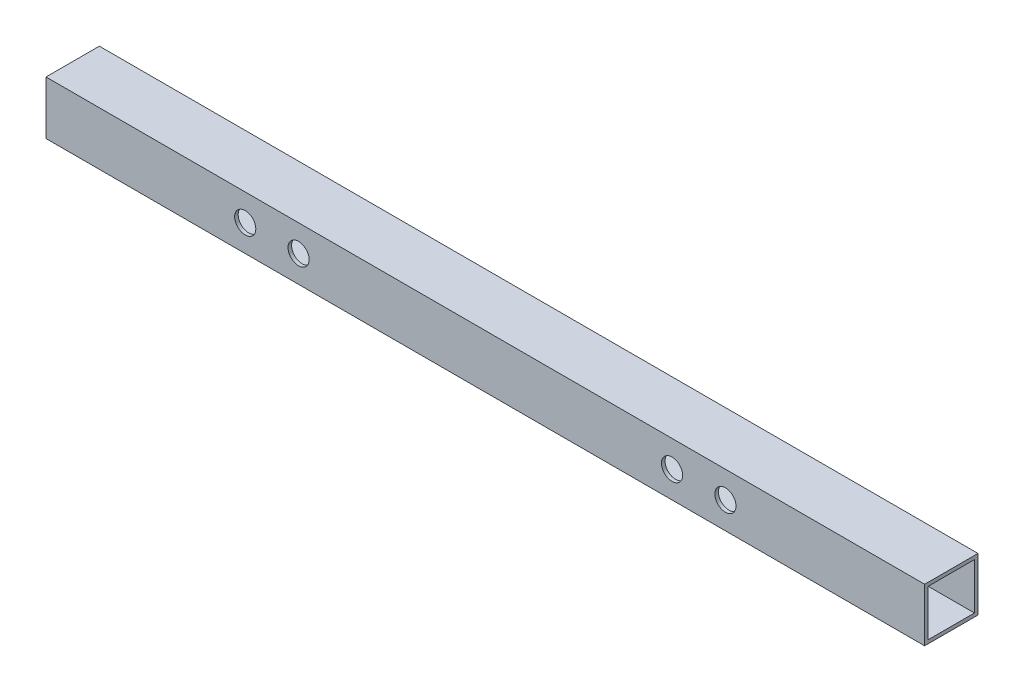
ISO-10303-21;
HEADER;
FILE_DESCRIPTION(('STEP AP214'),'2;1');
FILE_NAME('part.step','',(''),(''),'','','');
FILE_SCHEMA(('AUTOMOTIVE_DESIGN { 1 0 10303 214 1 1 1 1 }'));
ENDSEC;
DATA;
#1=APPLICATION_CONTEXT('core data for automotive mechanical design processes');
#2=APPLICATION_PROTOCOL_DEFINITION('international standard','automotive_design',2000,#1);
#3=PRODUCT_CONTEXT('',#1,'mechanical');
#4=PRODUCT('Part','Part','',(#3));
#5=PRODUCT_RELATED_PRODUCT_CATEGORY('part','',(#4));
#6=PRODUCT_DEFINITION_FORMATION('','',#4);
#7=PRODUCT_DEFINITION_CONTEXT('part definition',#1,'design');
#8=PRODUCT_DEFINITION('design','',#6,#7);
#9=PRODUCT_DEFINITION_SHAPE('','',#8);
#10=(LENGTH_UNIT() NAMED_UNIT(*) SI_UNIT(.MILLI.,.METRE.));
#11=(NAMED_UNIT(*) PLANE_ANGLE_UNIT() SI_UNIT($,.RADIAN.));
#12=(NAMED_UNIT(*) SI_UNIT($,.STERADIAN.) SOLID_ANGLE_UNIT());
#13=UNCERTAINTY_MEASURE_WITH_UNIT(LENGTH_MEASURE(1.E-05),#10,'distance_accuracy_value','');
#14=(GEOMETRIC_REPRESENTATION_CONTEXT(3) GLOBAL_UNCERTAINTY_ASSIGNED_CONTEXT((#13)) GLOBAL_UNIT_ASSIGNED_CONTEXT((#10,
#11,#12)) REPRESENTATION_CONTEXT('',''));
#15=CARTESIAN_POINT('',(0.,0.,0.));
#16=DIRECTION('',(0.,0.,1.));
#17=DIRECTION('',(1.,0.,0.));
#18=AXIS2_PLACEMENT_3D('',#15,#16,#17);
#19=CARTESIAN_POINT('',(422.2747248,-12.7,25.4));
#20=DIRECTION('',(0.,0.,-1.));
#21=DIRECTION('',(-1.,0.,0.));
#22=AXIS2_PLACEMENT_3D('',#19,#20,#21);
#23=PLANE('',#22);
#24=CARTESIAN_POINT('',(120.2373624,0.,25.4));
#25=DIRECTION('',(0.,0.,-1.));
#26=DIRECTION('',(1.,0.,0.));
#27=AXIS2_PLACEMENT_3D('',#24,#25,#26);
#28=CIRCLE('',#27,5.03000000000001);
#29=CARTESIAN_POINT('',(125.2673624,0.,25.4));
#30=VERTEX_POINT('',#29);
#31=EDGE_CURVE('E266',#30,#30,#28,.T.);
#32=ORIENTED_EDGE('',*,*,#31,.T.);
#33=EDGE_LOOP('',(#32));
#34=FACE_BOUND('',#33,.T.);
#35=CARTESIAN_POINT('',(94.8373624,0.,25.4));
#36=DIRECTION('',(0.,0.,-1.));
#37=DIRECTION('',(1.,0.,0.));
#38=AXIS2_PLACEMENT_3D('',#35,#36,#37);
#39=CIRCLE('',#38,5.03000000000001);
#40=CARTESIAN_POINT('',(99.8673624,0.,25.4));
#41=VERTEX_POINT('',#40);
#42=EDGE_CURVE('E159',#41,#41,#39,.T.);
#43=ORIENTED_EDGE('',*,*,#42,.T.);
#44=EDGE_LOOP('',(#43));
#45=FACE_BOUND('',#44,.T.);
#46=CARTESIAN_POINT('',(298.0373624,0.,25.4));
#47=DIRECTION('',(0.,0.,1.));
#48=DIRECTION('',(1.,0.,0.));
#49=AXIS2_PLACEMENT_3D('',#46,#47,#48);
#50=CIRCLE('',#49,5.02999999999998);
#51=CARTESIAN_POINT('',(303.0673624,0.,25.4));
#52=VERTEX_POINT('',#51);
#53=EDGE_CURVE('E151',#52,#52,#50,.T.);
#54=ORIENTED_EDGE('',*,*,#53,.F.);
#55=EDGE_LOOP('',(#54));
#56=FACE_BOUND('',#55,.T.);
#57=DIRECTION('',(-1.,0.,0.));
#58=VECTOR('',#57,1.);
#59=CARTESIAN_POINT('',(422.2747248,12.7,25.4));
#60=LINE('',#59,#58);
#61=CARTESIAN_POINT('',(418.2747248,12.7,25.4));
#62=VERTEX_POINT('',#61);
#63=CARTESIAN_POINT('',(0.,12.7,25.3999999999999));
#64=VERTEX_POINT('',#63);
#65=EDGE_CURVE('E127',#62,#64,#60,.T.);
#66=ORIENTED_EDGE('',*,*,#65,.T.);
#67=DIRECTION('',(0.,1.,0.));
#68=VECTOR('',#67,1.);
#69=CARTESIAN_POINT('',(0.,-12.7,25.3999999999999));
#70=LINE('',#69,#68);
#71=CARTESIAN_POINT('',(0.,-12.7,25.3999999999999));
#72=VERTEX_POINT('',#71);
#73=EDGE_CURVE('E24',#72,#64,#70,.T.);
#74=ORIENTED_EDGE('',*,*,#73,.F.);
#75=DIRECTION('',(-1.,0.,0.));
#76=VECTOR('',#75,1.);
#77=CARTESIAN_POINT('',(422.2747248,-12.7,25.4));
#78=LINE('',#77,#76);
#79=CARTESIAN_POINT('',(418.2747248,-12.7,25.4));
#80=VERTEX_POINT('',#79);
#81=EDGE_CURVE('E119',#80,#72,#78,.T.);
#82=ORIENTED_EDGE('',*,*,#81,.F.);
#83=DIRECTION('',(0.,1.,0.));
#84=VECTOR('',#83,1.);
#85=CARTESIAN_POINT('',(418.2747248,-12.7,25.4));
#86=LINE('',#85,#84);
#87=EDGE_CURVE('E9',#80,#62,#86,.T.);
#88=ORIENTED_EDGE('',*,*,#87,.T.);
#89=EDGE_LOOP('',(#66,#74,#82,#88));
#90=FACE_BOUND('',#89,.T.);
#91=CARTESIAN_POINT('',(323.4373624,0.,25.4));
#92=DIRECTION('',(0.,0.,1.));
#93=DIRECTION('',(1.,0.,0.));
#94=AXIS2_PLACEMENT_3D('',#91,#92,#93);
#95=CIRCLE('',#94,5.02999999999998);
#96=CARTESIAN_POINT('',(328.4673624,0.,25.4));
#97=VERTEX_POINT('',#96);
#98=EDGE_CURVE('E155',#97,#97,#95,.T.);
#99=ORIENTED_EDGE('',*,*,#98,.F.);
#100=EDGE_LOOP('',(#99));
#101=FACE_BOUND('',#100,.T.);
#102=ADVANCED_FACE('F15',(#34,#45,#56,#90,#101),#23,.F.);
#103=CARTESIAN_POINT('',(0.,-12.7,0.));
#104=DIRECTION('',(0.,0.,1.));
#105=DIRECTION('',(1.,0.,0.));
#106=AXIS2_PLACEMENT_3D('',#103,#104,#105);
#107=PLANE('',#106);
#108=CARTESIAN_POINT('',(120.2373624,0.,0.));
#109=DIRECTION('',(0.,0.,-1.));
#110=DIRECTION('',(1.,0.,0.));
#111=AXIS2_PLACEMENT_3D('',#108,#109,#110);
#112=CIRCLE('',#111,5.03000000000001);
#113=CARTESIAN_POINT('',(125.2673624,0.,0.));
#114=VERTEX_POINT('',#113);
#115=EDGE_CURVE('E264',#114,#114,#112,.T.);
#116=ORIENTED_EDGE('',*,*,#115,.F.);
#117=EDGE_LOOP('',(#116));
#118=FACE_BOUND('',#117,.T.);
#119=CARTESIAN_POINT('',(94.8373624,0.,0.));
#120=DIRECTION('',(0.,0.,-1.));
#121=DIRECTION('',(1.,0.,0.));
#122=AXIS2_PLACEMENT_3D('',#119,#120,#121);
#123=CIRCLE('',#122,5.03000000000001);
#124=CARTESIAN_POINT('',(99.8673624,0.,0.));
#125=VERTEX_POINT('',#124);
#126=EDGE_CURVE('E166',#125,#125,#123,.T.);
#127=ORIENTED_EDGE('',*,*,#126,.F.);
#128=EDGE_LOOP('',(#127));
#129=FACE_BOUND('',#128,.T.);
#130=CARTESIAN_POINT('',(298.0373624,0.,0.));
#131=DIRECTION('',(0.,0.,1.));
#132=DIRECTION('',(1.,0.,0.));
#133=AXIS2_PLACEMENT_3D('',#130,#131,#132);
#134=CIRCLE('',#133,5.02999999999998);
#135=CARTESIAN_POINT('',(303.0673624,0.,0.));
#136=VERTEX_POINT('',#135);
#137=EDGE_CURVE('E184',#136,#136,#134,.T.);
#138=ORIENTED_EDGE('',*,*,#137,.T.);
#139=EDGE_LOOP('',(#138));
#140=FACE_BOUND('',#139,.T.);
#141=DIRECTION('',(1.,0.,0.));
#142=VECTOR('',#141,1.);
#143=CARTESIAN_POINT('',(0.,12.7,0.));
#144=LINE('',#143,#142);
#145=CARTESIAN_POINT('',(0.,12.7,0.));
#146=VERTEX_POINT('',#145);
#147=CARTESIAN_POINT('',(418.2747248,12.7,0.));
#148=VERTEX_POINT('',#147);
#149=EDGE_CURVE('E133',#146,#148,#144,.T.);
#150=ORIENTED_EDGE('',*,*,#149,.T.);
#151=DIRECTION('',(0.,1.,0.));
#152=VECTOR('',#151,1.);
#153=CARTESIAN_POINT('',(418.2747248,-12.7,0.));
#154=LINE('',#153,#152);
#155=CARTESIAN_POINT('',(418.2747248,-12.7,0.));
#156=VERTEX_POINT('',#155);
#157=EDGE_CURVE('E126',#156,#148,#154,.T.);
#158=ORIENTED_EDGE('',*,*,#157,.F.);
#159=DIRECTION('',(1.,0.,0.));
#160=VECTOR('',#159,1.);
#161=CARTESIAN_POINT('',(0.,-12.7,0.));
#162=LINE('',#161,#160);
#163=CARTESIAN_POINT('',(0.,-12.7,0.));
#164=VERTEX_POINT('',#163);
#165=EDGE_CURVE('E124',#164,#156,#162,.T.);
#166=ORIENTED_EDGE('',*,*,#165,.F.);
#167=DIRECTION('',(0.,1.,0.));
#168=VECTOR('',#167,1.);
#169=CARTESIAN_POINT('',(0.,-12.7,0.));
#170=LINE('',#169,#168);
#171=EDGE_CURVE('E136',#164,#146,#170,.T.);
#172=ORIENTED_EDGE('',*,*,#171,.T.);
#173=EDGE_LOOP('',(#150,#158,#166,#172));
#174=FACE_BOUND('',#173,.T.);
#175=CARTESIAN_POINT('',(323.4373624,0.,0.));
#176=DIRECTION('',(0.,0.,1.));
#177=DIRECTION('',(1.,0.,0.));
#178=AXIS2_PLACEMENT_3D('',#175,#176,#177);
#179=CIRCLE('',#178,5.02999999999998);
#180=CARTESIAN_POINT('',(328.4673624,0.,0.));
#181=VERTEX_POINT('',#180);
#182=EDGE_CURVE('E163',#181,#181,#179,.T.);
#183=ORIENTED_EDGE('',*,*,#182,.T.);
#184=EDGE_LOOP('',(#183));
#185=FACE_BOUND('',#184,.T.);
#186=ADVANCED_FACE('F212',(#118,#129,#140,#174,#185),#107,.F.);
#187=CARTESIAN_POINT('',(422.2747248,-12.7,23.7109));
#188=DIRECTION('',(0.,0.,-1.));
#189=DIRECTION('',(-1.,0.,0.));
#190=AXIS2_PLACEMENT_3D('',#187,#188,#189);
#191=PLANE('',#190);
#192=CARTESIAN_POINT('',(120.2373624,0.,23.7109));
#193=DIRECTION('',(0.,0.,-1.));
#194=DIRECTION('',(-1.,0.,0.));
#195=AXIS2_PLACEMENT_3D('',#192,#193,#194);
#196=CIRCLE('',#195,5.03000000000001);
#197=CARTESIAN_POINT('',(115.2073624,0.,23.7109));
#198=VERTEX_POINT('',#197);
#199=EDGE_CURVE('E172',#198,#198,#196,.T.);
#200=ORIENTED_EDGE('',*,*,#199,.F.);
#201=EDGE_LOOP('',(#200));
#202=FACE_BOUND('',#201,.T.);
#203=CARTESIAN_POINT('',(94.8373624,0.,23.7109));
#204=DIRECTION('',(0.,0.,-1.));
#205=DIRECTION('',(-1.,0.,0.));
#206=AXIS2_PLACEMENT_3D('',#203,#204,#205);
#207=CIRCLE('',#206,5.03000000000001);
#208=CARTESIAN_POINT('',(89.8073624,0.,23.7109));
#209=VERTEX_POINT('',#208);
#210=EDGE_CURVE('E158',#209,#209,#207,.T.);
#211=ORIENTED_EDGE('',*,*,#210,.F.);
#212=EDGE_LOOP('',(#211));
#213=FACE_BOUND('',#212,.T.);
#214=CARTESIAN_POINT('',(298.0373624,0.,23.7109));
#215=DIRECTION('',(0.,0.,-1.));
#216=DIRECTION('',(-1.,0.,0.));
#217=AXIS2_PLACEMENT_3D('',#214,#215,#216);
#218=CIRCLE('',#217,5.02999999999998);
#219=CARTESIAN_POINT('',(293.0073624,0.,23.7109));
#220=VERTEX_POINT('',#219);
#221=EDGE_CURVE('E118',#220,#220,#218,.F.);
#222=ORIENTED_EDGE('',*,*,#221,.T.);
#223=EDGE_LOOP('',(#222));
#224=FACE_BOUND('',#223,.T.);
#225=DIRECTION('',(-1.,0.,0.));
#226=VECTOR('',#225,1.);
#227=CARTESIAN_POINT('',(422.2747248,11.0109,23.7109));
#228=LINE('',#227,#226);
#229=CARTESIAN_POINT('',(418.2747248,11.0109,23.7109));
#230=VERTEX_POINT('',#229);
#231=CARTESIAN_POINT('',(0.,11.0109,23.7108999999999));
#232=VERTEX_POINT('',#231);
#233=EDGE_CURVE('E81',#230,#232,#228,.T.);
#234=ORIENTED_EDGE('',*,*,#233,.F.);
#235=DIRECTION('',(0.,1.,0.));
#236=VECTOR('',#235,1.);
#237=CARTESIAN_POINT('',(418.2747248,-12.7,23.7109));
#238=LINE('',#237,#236);
#239=CARTESIAN_POINT('',(418.2747248,-11.0109,23.7109));
#240=VERTEX_POINT('',#239);
#241=EDGE_CURVE('E99',#240,#230,#238,.T.);
#242=ORIENTED_EDGE('',*,*,#241,.F.);
#243=DIRECTION('',(-1.,0.,0.));
#244=VECTOR('',#243,1.);
#245=CARTESIAN_POINT('',(422.2747248,-11.0109,23.7109));
#246=LINE('',#245,#244);
#247=CARTESIAN_POINT('',(0.,-11.0109,23.7108999999999));
#248=VERTEX_POINT('',#247);
#249=EDGE_CURVE('E97',#240,#248,#246,.T.);
#250=ORIENTED_EDGE('',*,*,#249,.T.);
#251=DIRECTION('',(0.,1.,0.));
#252=VECTOR('',#251,1.);
#253=CARTESIAN_POINT('',(0.,-12.7,23.7108999999999));
#254=LINE('',#253,#252);
#255=EDGE_CURVE('E94',#248,#232,#254,.T.);
#256=ORIENTED_EDGE('',*,*,#255,.T.);
#257=EDGE_LOOP('',(#234,#242,#250,#256));
#258=FACE_BOUND('',#257,.T.);
#259=CARTESIAN_POINT('',(323.4373624,0.,23.7109));
#260=DIRECTION('',(0.,0.,-1.));
#261=DIRECTION('',(-1.,0.,0.));
#262=AXIS2_PLACEMENT_3D('',#259,#260,#261);
#263=CIRCLE('',#262,5.02999999999998);
#264=CARTESIAN_POINT('',(318.4073624,0.,23.7109));
#265=VERTEX_POINT('',#264);
#266=EDGE_CURVE('E154',#265,#265,#263,.F.);
#267=ORIENTED_EDGE('',*,*,#266,.T.);
#268=EDGE_LOOP('',(#267));
#269=FACE_BOUND('',#268,.T.);
#270=ADVANCED_FACE('F95',(#202,#213,#224,#258,#269),#191,.T.);
#271=CARTESIAN_POINT('',(0.,-12.7,1.6891));
#272=DIRECTION('',(0.,0.,1.));
#273=DIRECTION('',(1.,0.,0.));
#274=AXIS2_PLACEMENT_3D('',#271,#272,#273);
#275=PLANE('',#274);
#276=CARTESIAN_POINT('',(120.2373624,0.,1.6891));
#277=DIRECTION('',(0.,0.,1.));
#278=DIRECTION('',(1.,0.,0.));
#279=AXIS2_PLACEMENT_3D('',#276,#277,#278);
#280=CIRCLE('',#279,5.03000000000001);
#281=CARTESIAN_POINT('',(125.2673624,0.,1.6891));
#282=VERTEX_POINT('',#281);
#283=EDGE_CURVE('E19',#282,#282,#280,.T.);
#284=ORIENTED_EDGE('',*,*,#283,.F.);
#285=EDGE_LOOP('',(#284));
#286=FACE_BOUND('',#285,.T.);
#287=CARTESIAN_POINT('',(94.8373624,0.,1.6891));
#288=DIRECTION('',(0.,0.,1.));
#289=DIRECTION('',(1.,0.,0.));
#290=AXIS2_PLACEMENT_3D('',#287,#288,#289);
#291=CIRCLE('',#290,5.03000000000001);
#292=CARTESIAN_POINT('',(99.8673624,0.,1.6891));
#293=VERTEX_POINT('',#292);
#294=EDGE_CURVE('E156',#293,#293,#291,.T.);
#295=ORIENTED_EDGE('',*,*,#294,.F.);
#296=EDGE_LOOP('',(#295));
#297=FACE_BOUND('',#296,.T.);
#298=CARTESIAN_POINT('',(298.0373624,0.,1.6891));
#299=DIRECTION('',(0.,0.,1.));
#300=DIRECTION('',(1.,0.,0.));
#301=AXIS2_PLACEMENT_3D('',#298,#299,#300);
#302=CIRCLE('',#301,5.02999999999998);
#303=CARTESIAN_POINT('',(303.0673624,0.,1.6891));
#304=VERTEX_POINT('',#303);
#305=EDGE_CURVE('E148',#304,#304,#302,.F.);
#306=ORIENTED_EDGE('',*,*,#305,.T.);
#307=EDGE_LOOP('',(#306));
#308=FACE_BOUND('',#307,.T.);
#309=DIRECTION('',(1.,0.,0.));
#310=VECTOR('',#309,1.);
#311=CARTESIAN_POINT('',(0.,11.0109,1.6891));
#312=LINE('',#311,#310);
#313=CARTESIAN_POINT('',(0.,11.0109,1.6891));
#314=VERTEX_POINT('',#313);
#315=CARTESIAN_POINT('',(418.2747248,11.0109,1.6891));
#316=VERTEX_POINT('',#315);
#317=EDGE_CURVE('E104',#314,#316,#312,.T.);
#318=ORIENTED_EDGE('',*,*,#317,.F.);
#319=DIRECTION('',(0.,1.,0.));
#320=VECTOR('',#319,1.);
#321=CARTESIAN_POINT('',(0.,-12.7,1.6891));
#322=LINE('',#321,#320);
#323=CARTESIAN_POINT('',(0.,-11.0109,1.6891));
#324=VERTEX_POINT('',#323);
#325=EDGE_CURVE('E100',#324,#314,#322,.T.);
#326=ORIENTED_EDGE('',*,*,#325,.F.);
#327=DIRECTION('',(1.,0.,0.));
#328=VECTOR('',#327,1.);
#329=CARTESIAN_POINT('',(0.,-11.0109,1.6891));
#330=LINE('',#329,#328);
#331=CARTESIAN_POINT('',(418.2747248,-11.0109,1.6891));
#332=VERTEX_POINT('',#331);
#333=EDGE_CURVE('E111',#324,#332,#330,.T.);
#334=ORIENTED_EDGE('',*,*,#333,.T.);
#335=DIRECTION('',(0.,1.,0.));
#336=VECTOR('',#335,1.);
#337=CARTESIAN_POINT('',(418.2747248,-12.7,1.6891));
#338=LINE('',#337,#336);
#339=EDGE_CURVE('E109',#332,#316,#338,.T.);
#340=ORIENTED_EDGE('',*,*,#339,.T.);
#341=EDGE_LOOP('',(#318,#326,#334,#340));
#342=FACE_BOUND('',#341,.T.);
#343=CARTESIAN_POINT('',(323.4373624,0.,1.6891));
#344=DIRECTION('',(0.,0.,1.));
#345=DIRECTION('',(1.,0.,0.));
#346=AXIS2_PLACEMENT_3D('',#343,#344,#345);
#347=CIRCLE('',#346,5.02999999999998);
#348=CARTESIAN_POINT('',(328.4673624,0.,1.6891));
#349=VERTEX_POINT('',#348);
#350=EDGE_CURVE('E152',#349,#349,#347,.F.);
#351=ORIENTED_EDGE('',*,*,#350,.T.);
#352=EDGE_LOOP('',(#351));
#353=FACE_BOUND('',#352,.T.);
#354=ADVANCED_FACE('F195',(#286,#297,#308,#342,#353),#275,.T.);
#355=CARTESIAN_POINT('',(0.,-12.7,25.3999999999999));
#356=DIRECTION('',(1.,0.,0.));
#357=DIRECTION('',(0.,0.,-1.));
#358=AXIS2_PLACEMENT_3D('',#355,#356,#357);
#359=PLANE('',#358);
#360=DIRECTION('',(0.,0.,-1.));
#361=VECTOR('',#360,1.);
#362=CARTESIAN_POINT('',(0.,12.7,25.3999999999999));
#363=LINE('',#362,#361);
#364=EDGE_CURVE('E130',#64,#146,#363,.T.);
#365=ORIENTED_EDGE('',*,*,#364,.T.);
#366=ORIENTED_EDGE('',*,*,#171,.F.);
#367=DIRECTION('',(0.,0.,-1.));
#368=VECTOR('',#367,1.);
#369=CARTESIAN_POINT('',(0.,-12.7,25.3999999999999));
#370=LINE('',#369,#368);
#371=EDGE_CURVE('E121',#72,#164,#370,.T.);
#372=ORIENTED_EDGE('',*,*,#371,.F.);
#373=ORIENTED_EDGE('',*,*,#73,.T.);
#374=EDGE_LOOP('',(#365,#366,#372,#373));
#375=FACE_BOUND('',#374,.T.);
#376=DIRECTION('',(0.,0.,-1.));
#377=VECTOR('',#376,1.);
#378=CARTESIAN_POINT('',(0.,11.0109,25.3999999999999));
#379=LINE('',#378,#377);
#380=EDGE_CURVE('E85',#232,#314,#379,.T.);
#381=ORIENTED_EDGE('',*,*,#380,.F.);
#382=ORIENTED_EDGE('',*,*,#255,.F.);
#383=DIRECTION('',(0.,0.,-1.));
#384=VECTOR('',#383,1.);
#385=CARTESIAN_POINT('',(0.,-11.0109,25.3999999999999));
#386=LINE('',#385,#384);
#387=EDGE_CURVE('E32',#248,#324,#386,.T.);
#388=ORIENTED_EDGE('',*,*,#387,.T.);
#389=ORIENTED_EDGE('',*,*,#325,.T.);
#390=EDGE_LOOP('',(#381,#382,#388,#389));
#391=FACE_BOUND('',#390,.T.);
#392=ADVANCED_FACE('F103',(#375,#391),#359,.F.);
#393=CARTESIAN_POINT('',(418.2747248,-12.7,0.));
#394=DIRECTION('',(-1.,0.,0.));
#395=DIRECTION('',(0.,0.,1.));
#396=AXIS2_PLACEMENT_3D('',#393,#394,#395);
#397=PLANE('',#396);
#398=DIRECTION('',(0.,0.,1.));
#399=VECTOR('',#398,1.);
#400=CARTESIAN_POINT('',(418.2747248,12.7,0.));
#401=LINE('',#400,#399);
#402=EDGE_CURVE('E113',#148,#62,#401,.T.);
#403=ORIENTED_EDGE('',*,*,#402,.T.);
#404=ORIENTED_EDGE('',*,*,#87,.F.);
#405=DIRECTION('',(0.,0.,1.));
#406=VECTOR('',#405,1.);
#407=CARTESIAN_POINT('',(418.2747248,-12.7,0.));
#408=LINE('',#407,#406);
#409=EDGE_CURVE('E122',#156,#80,#408,.T.);
#410=ORIENTED_EDGE('',*,*,#409,.F.);
#411=ORIENTED_EDGE('',*,*,#157,.T.);
#412=EDGE_LOOP('',(#403,#404,#410,#411));
#413=FACE_BOUND('',#412,.T.);
#414=DIRECTION('',(0.,0.,1.));
#415=VECTOR('',#414,1.);
#416=CARTESIAN_POINT('',(418.2747248,11.0109,0.));
#417=LINE('',#416,#415);
#418=EDGE_CURVE('E88',#316,#230,#417,.T.);
#419=ORIENTED_EDGE('',*,*,#418,.F.);
#420=ORIENTED_EDGE('',*,*,#339,.F.);
#421=DIRECTION('',(0.,0.,1.));
#422=VECTOR('',#421,1.);
#423=CARTESIAN_POINT('',(418.2747248,-11.0109,0.));
#424=LINE('',#423,#422);
#425=EDGE_CURVE('E37',#332,#240,#424,.T.);
#426=ORIENTED_EDGE('',*,*,#425,.T.);
#427=ORIENTED_EDGE('',*,*,#241,.T.);
#428=EDGE_LOOP('',(#419,#420,#426,#427));
#429=FACE_BOUND('',#428,.T.);
#430=ADVANCED_FACE('F17',(#413,#429),#397,.F.);
#431=CARTESIAN_POINT('',(0.,-12.7,0.));
#432=DIRECTION('',(0.,-1.,0.));
#433=DIRECTION('',(0.,0.,-1.));
#434=AXIS2_PLACEMENT_3D('',#431,#432,#433);
#435=PLANE('',#434);
#436=ORIENTED_EDGE('',*,*,#409,.T.);
#437=ORIENTED_EDGE('',*,*,#81,.T.);
#438=ORIENTED_EDGE('',*,*,#371,.T.);
#439=ORIENTED_EDGE('',*,*,#165,.T.);
#440=EDGE_LOOP('',(#436,#437,#438,#439));
#441=FACE_BOUND('',#440,.T.);
#442=ADVANCED_FACE('F199',(#441),#435,.T.);
#443=CARTESIAN_POINT('',(0.,12.7,0.));
#444=DIRECTION('',(0.,-1.,0.));
#445=DIRECTION('',(0.,0.,-1.));
#446=AXIS2_PLACEMENT_3D('',#443,#444,#445);
#447=PLANE('',#446);
#448=ORIENTED_EDGE('',*,*,#402,.F.);
#449=ORIENTED_EDGE('',*,*,#149,.F.);
#450=ORIENTED_EDGE('',*,*,#364,.F.);
#451=ORIENTED_EDGE('',*,*,#65,.F.);
#452=EDGE_LOOP('',(#448,#449,#450,#451));
#453=FACE_BOUND('',#452,.T.);
#454=ADVANCED_FACE('F206',(#453),#447,.F.);
#455=CARTESIAN_POINT('',(0.,-11.0109,0.));
#456=DIRECTION('',(0.,-1.,0.));
#457=DIRECTION('',(0.,0.,-1.));
#458=AXIS2_PLACEMENT_3D('',#455,#456,#457);
#459=PLANE('',#458);
#460=ORIENTED_EDGE('',*,*,#425,.F.);
#461=ORIENTED_EDGE('',*,*,#333,.F.);
#462=ORIENTED_EDGE('',*,*,#387,.F.);
#463=ORIENTED_EDGE('',*,*,#249,.F.);
#464=EDGE_LOOP('',(#460,#461,#462,#463));
#465=FACE_BOUND('',#464,.T.);
#466=ADVANCED_FACE('F222',(#465),#459,.F.);
#467=CARTESIAN_POINT('',(0.,11.0109,0.));
#468=DIRECTION('',(0.,-1.,0.));
#469=DIRECTION('',(0.,0.,-1.));
#470=AXIS2_PLACEMENT_3D('',#467,#468,#469);
#471=PLANE('',#470);
#472=ORIENTED_EDGE('',*,*,#418,.T.);
#473=ORIENTED_EDGE('',*,*,#233,.T.);
#474=ORIENTED_EDGE('',*,*,#380,.T.);
#475=ORIENTED_EDGE('',*,*,#317,.T.);
#476=EDGE_LOOP('',(#472,#473,#474,#475));
#477=FACE_BOUND('',#476,.T.);
#478=ADVANCED_FACE('F83',(#477),#471,.T.);
#479=CARTESIAN_POINT('',(298.0373624,0.,25.4));
#480=DIRECTION('',(0.,0.,-1.));
#481=DIRECTION('',(-1.,0.,0.));
#482=AXIS2_PLACEMENT_3D('',#479,#480,#481);
#483=CYLINDRICAL_SURFACE('',#482,5.02999999999998);
#484=ORIENTED_EDGE('',*,*,#305,.F.);
#485=EDGE_LOOP('',(#484));
#486=FACE_BOUND('',#485,.T.);
#487=ORIENTED_EDGE('',*,*,#137,.F.);
#488=EDGE_LOOP('',(#487));
#489=FACE_BOUND('',#488,.T.);
#490=ADVANCED_FACE('F227',(#486,#489),#483,.F.);
#491=ORIENTED_EDGE('',*,*,#221,.F.);
#492=EDGE_LOOP('',(#491));
#493=FACE_BOUND('',#492,.T.);
#494=ORIENTED_EDGE('',*,*,#53,.T.);
#495=EDGE_LOOP('',(#494));
#496=FACE_BOUND('',#495,.T.);
#497=ADVANCED_FACE('F238',(#493,#496),#483,.F.);
#498=CARTESIAN_POINT('',(323.4373624,0.,25.4));
#499=DIRECTION('',(0.,0.,-1.));
#500=DIRECTION('',(-1.,0.,0.));
#501=AXIS2_PLACEMENT_3D('',#498,#499,#500);
#502=CYLINDRICAL_SURFACE('',#501,5.02999999999998);
#503=ORIENTED_EDGE('',*,*,#350,.F.);
#504=EDGE_LOOP('',(#503));
#505=FACE_BOUND('',#504,.T.);
#506=ORIENTED_EDGE('',*,*,#182,.F.);
#507=EDGE_LOOP('',(#506));
#508=FACE_BOUND('',#507,.T.);
#509=ADVANCED_FACE('F240',(#505,#508),#502,.F.);
#510=ORIENTED_EDGE('',*,*,#266,.F.);
#511=EDGE_LOOP('',(#510));
#512=FACE_BOUND('',#511,.T.);
#513=ORIENTED_EDGE('',*,*,#98,.T.);
#514=EDGE_LOOP('',(#513));
#515=FACE_BOUND('',#514,.T.);
#516=ADVANCED_FACE('F243',(#512,#515),#502,.F.);
#517=CARTESIAN_POINT('',(94.8373624,0.,25.4));
#518=DIRECTION('',(0.,0.,-1.));
#519=DIRECTION('',(-1.,0.,0.));
#520=AXIS2_PLACEMENT_3D('',#517,#518,#519);
#521=CYLINDRICAL_SURFACE('',#520,5.03000000000001);
#522=ORIENTED_EDGE('',*,*,#294,.T.);
#523=EDGE_LOOP('',(#522));
#524=FACE_BOUND('',#523,.T.);
#525=ORIENTED_EDGE('',*,*,#126,.T.);
#526=EDGE_LOOP('',(#525));
#527=FACE_BOUND('',#526,.T.);
#528=ADVANCED_FACE('F245',(#524,#527),#521,.F.);
#529=ORIENTED_EDGE('',*,*,#210,.T.);
#530=EDGE_LOOP('',(#529));
#531=FACE_BOUND('',#530,.T.);
#532=ORIENTED_EDGE('',*,*,#42,.F.);
#533=EDGE_LOOP('',(#532));
#534=FACE_BOUND('',#533,.T.);
#535=ADVANCED_FACE('F248',(#531,#534),#521,.F.);
#536=CARTESIAN_POINT('',(120.2373624,0.,25.4));
#537=DIRECTION('',(0.,0.,-1.));
#538=DIRECTION('',(-1.,0.,0.));
#539=AXIS2_PLACEMENT_3D('',#536,#537,#538);
#540=CYLINDRICAL_SURFACE('',#539,5.03000000000001);
#541=ORIENTED_EDGE('',*,*,#283,.T.);
#542=EDGE_LOOP('',(#541));
#543=FACE_BOUND('',#542,.T.);
#544=ORIENTED_EDGE('',*,*,#115,.T.);
#545=EDGE_LOOP('',(#544));
#546=FACE_BOUND('',#545,.T.);
#547=ADVANCED_FACE('F249',(#543,#546),#540,.F.);
#548=ORIENTED_EDGE('',*,*,#199,.T.);
#549=EDGE_LOOP('',(#548));
#550=FACE_BOUND('',#549,.T.);
#551=ORIENTED_EDGE('',*,*,#31,.F.);
#552=EDGE_LOOP('',(#551));
#553=FACE_BOUND('',#552,.T.);
#554=ADVANCED_FACE('F251',(#550,#553),#540,.F.);
#555=CLOSED_SHELL('',(#102,#186,#270,#354,#392,#430,#442,#454,#466,#478,#490,#497,#509,#516,
#528,#535,#547,#554));
#556=MANIFOLD_SOLID_BREP('B1',#555);
#557=ADVANCED_BREP_SHAPE_REPRESENTATION('',(#18,#556),#14);
#558=SHAPE_DEFINITION_REPRESENTATION(#9,#557);
ENDSEC;
END-ISO-10303-21;
